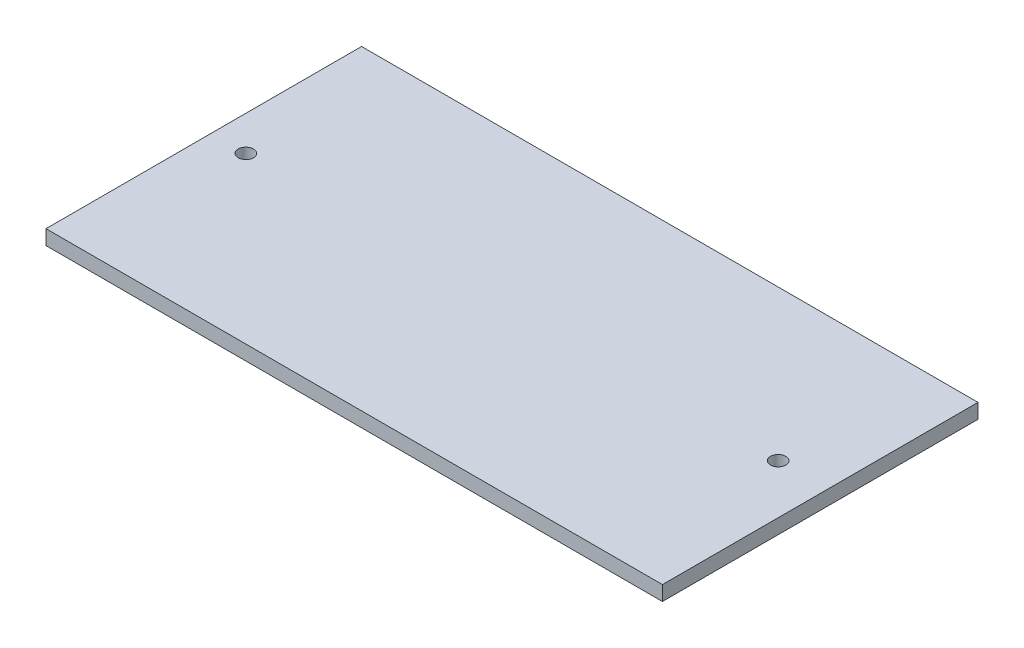
ISO-10303-21;
HEADER;
FILE_DESCRIPTION(('STEP AP214'),'2;1');
FILE_NAME('part.step','',(''),(''),'','','');
FILE_SCHEMA(('AUTOMOTIVE_DESIGN { 1 0 10303 214 1 1 1 1 }'));
ENDSEC;
DATA;
#1=APPLICATION_CONTEXT('core data for automotive mechanical design processes');
#2=APPLICATION_PROTOCOL_DEFINITION('international standard','automotive_design',2000,#1);
#3=PRODUCT_CONTEXT('',#1,'mechanical');
#4=PRODUCT('Part','Part','',(#3));
#5=PRODUCT_RELATED_PRODUCT_CATEGORY('part','',(#4));
#6=PRODUCT_DEFINITION_FORMATION('','',#4);
#7=PRODUCT_DEFINITION_CONTEXT('part definition',#1,'design');
#8=PRODUCT_DEFINITION('design','',#6,#7);
#9=PRODUCT_DEFINITION_SHAPE('','',#8);
#10=(LENGTH_UNIT() NAMED_UNIT(*) SI_UNIT(.MILLI.,.METRE.));
#11=(NAMED_UNIT(*) PLANE_ANGLE_UNIT() SI_UNIT($,.RADIAN.));
#12=(NAMED_UNIT(*) SI_UNIT($,.STERADIAN.) SOLID_ANGLE_UNIT());
#13=UNCERTAINTY_MEASURE_WITH_UNIT(LENGTH_MEASURE(1.E-05),#10,'distance_accuracy_value','');
#14=(GEOMETRIC_REPRESENTATION_CONTEXT(3) GLOBAL_UNCERTAINTY_ASSIGNED_CONTEXT((#13)) GLOBAL_UNIT_ASSIGNED_CONTEXT((#10,
#11,#12)) REPRESENTATION_CONTEXT('',''));
#15=CARTESIAN_POINT('',(0.,0.,0.));
#16=DIRECTION('',(0.,0.,1.));
#17=DIRECTION('',(1.,0.,0.));
#18=AXIS2_PLACEMENT_3D('',#15,#16,#17);
#19=CARTESIAN_POINT('',(0.,3.175,0.));
#20=DIRECTION('',(0.,1.,0.));
#21=DIRECTION('',(0.,0.,1.));
#22=AXIS2_PLACEMENT_3D('',#19,#20,#21);
#23=PLANE('',#22);
#24=CARTESIAN_POINT('',(-59.0875,3.175,-1.5875));
#25=DIRECTION('',(0.,1.,0.));
#26=DIRECTION('',(0.,0.,1.));
#27=AXIS2_PLACEMENT_3D('',#24,#25,#26);
#28=CIRCLE('',#27,1.65);
#29=CARTESIAN_POINT('',(-59.0875,3.175,0.0625000000000024));
#30=VERTEX_POINT('',#29);
#31=EDGE_CURVE('E100',#30,#30,#28,.T.);
#32=ORIENTED_EDGE('',*,*,#31,.F.);
#33=EDGE_LOOP('',(#32));
#34=FACE_BOUND('',#33,.T.);
#35=DIRECTION('',(0.,0.,-1.));
#36=VECTOR('',#35,1.);
#37=CARTESIAN_POINT('',(66.5875,3.175,-34.0875));
#38=LINE('',#37,#36);
#39=CARTESIAN_POINT('',(66.5875,3.175,34.0875));
#40=VERTEX_POINT('',#39);
#41=CARTESIAN_POINT('',(66.5875,3.175,-34.0875));
#42=VERTEX_POINT('',#41);
#43=EDGE_CURVE('E85',#40,#42,#38,.T.);
#44=ORIENTED_EDGE('',*,*,#43,.T.);
#45=DIRECTION('',(-1.,0.,0.));
#46=VECTOR('',#45,1.);
#47=CARTESIAN_POINT('',(-66.5875,3.175,-34.0875));
#48=LINE('',#47,#46);
#49=CARTESIAN_POINT('',(-66.5875,3.175,-34.0875));
#50=VERTEX_POINT('',#49);
#51=EDGE_CURVE('E80',#42,#50,#48,.T.);
#52=ORIENTED_EDGE('',*,*,#51,.T.);
#53=DIRECTION('',(0.,0.,1.));
#54=VECTOR('',#53,1.);
#55=CARTESIAN_POINT('',(-66.5875,3.175,-34.0875));
#56=LINE('',#55,#54);
#57=CARTESIAN_POINT('',(-66.5875,3.175,34.0875));
#58=VERTEX_POINT('',#57);
#59=EDGE_CURVE('E83',#50,#58,#56,.T.);
#60=ORIENTED_EDGE('',*,*,#59,.T.);
#61=DIRECTION('',(1.,0.,0.));
#62=VECTOR('',#61,1.);
#63=CARTESIAN_POINT('',(-66.5875,3.175,34.0875));
#64=LINE('',#63,#62);
#65=EDGE_CURVE('E50',#58,#40,#64,.T.);
#66=ORIENTED_EDGE('',*,*,#65,.T.);
#67=EDGE_LOOP('',(#44,#52,#60,#66));
#68=FACE_BOUND('',#67,.T.);
#69=CARTESIAN_POINT('',(55.9125,3.175,-1.5875));
#70=DIRECTION('',(0.,1.,0.));
#71=DIRECTION('',(0.,0.,1.));
#72=AXIS2_PLACEMENT_3D('',#69,#70,#71);
#73=CIRCLE('',#72,1.65);
#74=CARTESIAN_POINT('',(55.9125,3.175,0.0625000000000024));
#75=VERTEX_POINT('',#74);
#76=EDGE_CURVE('E115',#75,#75,#73,.T.);
#77=ORIENTED_EDGE('',*,*,#76,.F.);
#78=EDGE_LOOP('',(#77));
#79=FACE_BOUND('',#78,.T.);
#80=ADVANCED_FACE('F33',(#34,#68,#79),#23,.T.);
#81=CARTESIAN_POINT('',(0.,0.,0.));
#82=DIRECTION('',(0.,1.,0.));
#83=DIRECTION('',(0.,0.,1.));
#84=AXIS2_PLACEMENT_3D('',#81,#82,#83);
#85=PLANE('',#84);
#86=DIRECTION('',(0.,0.,-1.));
#87=VECTOR('',#86,1.);
#88=CARTESIAN_POINT('',(66.5875,0.,-34.0875));
#89=LINE('',#88,#87);
#90=CARTESIAN_POINT('',(66.5875,0.,34.0875));
#91=VERTEX_POINT('',#90);
#92=CARTESIAN_POINT('',(66.5875,0.,-34.0875));
#93=VERTEX_POINT('',#92);
#94=EDGE_CURVE('E97',#91,#93,#89,.T.);
#95=ORIENTED_EDGE('',*,*,#94,.F.);
#96=DIRECTION('',(1.,0.,0.));
#97=VECTOR('',#96,1.);
#98=CARTESIAN_POINT('',(-66.5875,0.,34.0875));
#99=LINE('',#98,#97);
#100=CARTESIAN_POINT('',(-66.5875,0.,34.0875));
#101=VERTEX_POINT('',#100);
#102=EDGE_CURVE('E73',#101,#91,#99,.T.);
#103=ORIENTED_EDGE('',*,*,#102,.F.);
#104=DIRECTION('',(0.,0.,1.));
#105=VECTOR('',#104,1.);
#106=CARTESIAN_POINT('',(-66.5875,0.,-34.0875));
#107=LINE('',#106,#105);
#108=CARTESIAN_POINT('',(-66.5875,0.,-34.0875));
#109=VERTEX_POINT('',#108);
#110=EDGE_CURVE('E67',#109,#101,#107,.T.);
#111=ORIENTED_EDGE('',*,*,#110,.F.);
#112=DIRECTION('',(-1.,0.,0.));
#113=VECTOR('',#112,1.);
#114=CARTESIAN_POINT('',(-66.5875,0.,-34.0875));
#115=LINE('',#114,#113);
#116=EDGE_CURVE('E89',#93,#109,#115,.T.);
#117=ORIENTED_EDGE('',*,*,#116,.F.);
#118=EDGE_LOOP('',(#95,#103,#111,#117));
#119=FACE_BOUND('',#118,.T.);
#120=CARTESIAN_POINT('',(-59.0875,0.,-1.5875));
#121=DIRECTION('',(0.,1.,0.));
#122=DIRECTION('',(0.,0.,1.));
#123=AXIS2_PLACEMENT_3D('',#120,#121,#122);
#124=CIRCLE('',#123,1.65);
#125=CARTESIAN_POINT('',(-59.0875,0.,0.0625000000000024));
#126=VERTEX_POINT('',#125);
#127=EDGE_CURVE('E112',#126,#126,#124,.T.);
#128=ORIENTED_EDGE('',*,*,#127,.T.);
#129=EDGE_LOOP('',(#128));
#130=FACE_BOUND('',#129,.T.);
#131=CARTESIAN_POINT('',(55.9125,0.,-1.5875));
#132=DIRECTION('',(0.,1.,0.));
#133=DIRECTION('',(0.,0.,1.));
#134=AXIS2_PLACEMENT_3D('',#131,#132,#133);
#135=CIRCLE('',#134,1.65);
#136=CARTESIAN_POINT('',(55.9125,0.,0.0625000000000024));
#137=VERTEX_POINT('',#136);
#138=EDGE_CURVE('E118',#137,#137,#135,.T.);
#139=ORIENTED_EDGE('',*,*,#138,.T.);
#140=EDGE_LOOP('',(#139));
#141=FACE_BOUND('',#140,.T.);
#142=ADVANCED_FACE('F108',(#119,#130,#141),#85,.F.);
#143=CARTESIAN_POINT('',(66.5875,3.175,-34.0875));
#144=DIRECTION('',(-1.,0.,0.));
#145=DIRECTION('',(0.,0.,1.));
#146=AXIS2_PLACEMENT_3D('',#143,#144,#145);
#147=PLANE('',#146);
#148=ORIENTED_EDGE('',*,*,#94,.T.);
#149=DIRECTION('',(0.,-1.,0.));
#150=VECTOR('',#149,1.);
#151=CARTESIAN_POINT('',(66.5875,3.175,-34.0875));
#152=LINE('',#151,#150);
#153=EDGE_CURVE('E11',#42,#93,#152,.T.);
#154=ORIENTED_EDGE('',*,*,#153,.F.);
#155=ORIENTED_EDGE('',*,*,#43,.F.);
#156=DIRECTION('',(0.,-1.,0.));
#157=VECTOR('',#156,1.);
#158=CARTESIAN_POINT('',(66.5875,3.175,34.0875));
#159=LINE('',#158,#157);
#160=EDGE_CURVE('E93',#40,#91,#159,.T.);
#161=ORIENTED_EDGE('',*,*,#160,.T.);
#162=EDGE_LOOP('',(#148,#154,#155,#161));
#163=FACE_BOUND('',#162,.T.);
#164=ADVANCED_FACE('F35',(#163),#147,.F.);
#165=CARTESIAN_POINT('',(-66.5875,3.175,-34.0875));
#166=DIRECTION('',(0.,0.,1.));
#167=DIRECTION('',(1.,0.,0.));
#168=AXIS2_PLACEMENT_3D('',#165,#166,#167);
#169=PLANE('',#168);
#170=ORIENTED_EDGE('',*,*,#116,.T.);
#171=DIRECTION('',(0.,-1.,0.));
#172=VECTOR('',#171,1.);
#173=CARTESIAN_POINT('',(-66.5875,3.175,-34.0875));
#174=LINE('',#173,#172);
#175=EDGE_CURVE('E42',#50,#109,#174,.T.);
#176=ORIENTED_EDGE('',*,*,#175,.F.);
#177=ORIENTED_EDGE('',*,*,#51,.F.);
#178=ORIENTED_EDGE('',*,*,#153,.T.);
#179=EDGE_LOOP('',(#170,#176,#177,#178));
#180=FACE_BOUND('',#179,.T.);
#181=ADVANCED_FACE('F88',(#180),#169,.F.);
#182=CARTESIAN_POINT('',(-66.5875,3.175,-34.0875));
#183=DIRECTION('',(1.,0.,0.));
#184=DIRECTION('',(0.,0.,-1.));
#185=AXIS2_PLACEMENT_3D('',#182,#183,#184);
#186=PLANE('',#185);
#187=ORIENTED_EDGE('',*,*,#110,.T.);
#188=DIRECTION('',(0.,-1.,0.));
#189=VECTOR('',#188,1.);
#190=CARTESIAN_POINT('',(-66.5875,3.175,34.0875));
#191=LINE('',#190,#189);
#192=EDGE_CURVE('E90',#58,#101,#191,.T.);
#193=ORIENTED_EDGE('',*,*,#192,.F.);
#194=ORIENTED_EDGE('',*,*,#59,.F.);
#195=ORIENTED_EDGE('',*,*,#175,.T.);
#196=EDGE_LOOP('',(#187,#193,#194,#195));
#197=FACE_BOUND('',#196,.T.);
#198=ADVANCED_FACE('F91',(#197),#186,.F.);
#199=CARTESIAN_POINT('',(-66.5875,3.175,34.0875));
#200=DIRECTION('',(0.,0.,-1.));
#201=DIRECTION('',(-1.,0.,0.));
#202=AXIS2_PLACEMENT_3D('',#199,#200,#201);
#203=PLANE('',#202);
#204=ORIENTED_EDGE('',*,*,#102,.T.);
#205=ORIENTED_EDGE('',*,*,#160,.F.);
#206=ORIENTED_EDGE('',*,*,#65,.F.);
#207=ORIENTED_EDGE('',*,*,#192,.T.);
#208=EDGE_LOOP('',(#204,#205,#206,#207));
#209=FACE_BOUND('',#208,.T.);
#210=ADVANCED_FACE('F105',(#209),#203,.F.);
#211=CARTESIAN_POINT('',(-59.0875,3.175,-1.5875));
#212=DIRECTION('',(0.,-1.,0.));
#213=DIRECTION('',(0.,0.,-1.));
#214=AXIS2_PLACEMENT_3D('',#211,#212,#213);
#215=CYLINDRICAL_SURFACE('',#214,1.65);
#216=ORIENTED_EDGE('',*,*,#31,.T.);
#217=EDGE_LOOP('',(#216));
#218=FACE_BOUND('',#217,.T.);
#219=ORIENTED_EDGE('',*,*,#127,.F.);
#220=EDGE_LOOP('',(#219));
#221=FACE_BOUND('',#220,.T.);
#222=ADVANCED_FACE('F135',(#218,#221),#215,.F.);
#223=CARTESIAN_POINT('',(55.9125,3.175,-1.5875));
#224=DIRECTION('',(0.,-1.,0.));
#225=DIRECTION('',(0.,0.,-1.));
#226=AXIS2_PLACEMENT_3D('',#223,#224,#225);
#227=CYLINDRICAL_SURFACE('',#226,1.65);
#228=ORIENTED_EDGE('',*,*,#76,.T.);
#229=EDGE_LOOP('',(#228));
#230=FACE_BOUND('',#229,.T.);
#231=ORIENTED_EDGE('',*,*,#138,.F.);
#232=EDGE_LOOP('',(#231));
#233=FACE_BOUND('',#232,.T.);
#234=ADVANCED_FACE('F124',(#230,#233),#227,.F.);
#235=CLOSED_SHELL('',(#80,#142,#164,#181,#198,#210,#222,#234));
#236=MANIFOLD_SOLID_BREP('B2',#235);
#237=ADVANCED_BREP_SHAPE_REPRESENTATION('',(#18,#236),#14);
#238=SHAPE_DEFINITION_REPRESENTATION(#9,#237);
ENDSEC;
END-ISO-10303-21;
